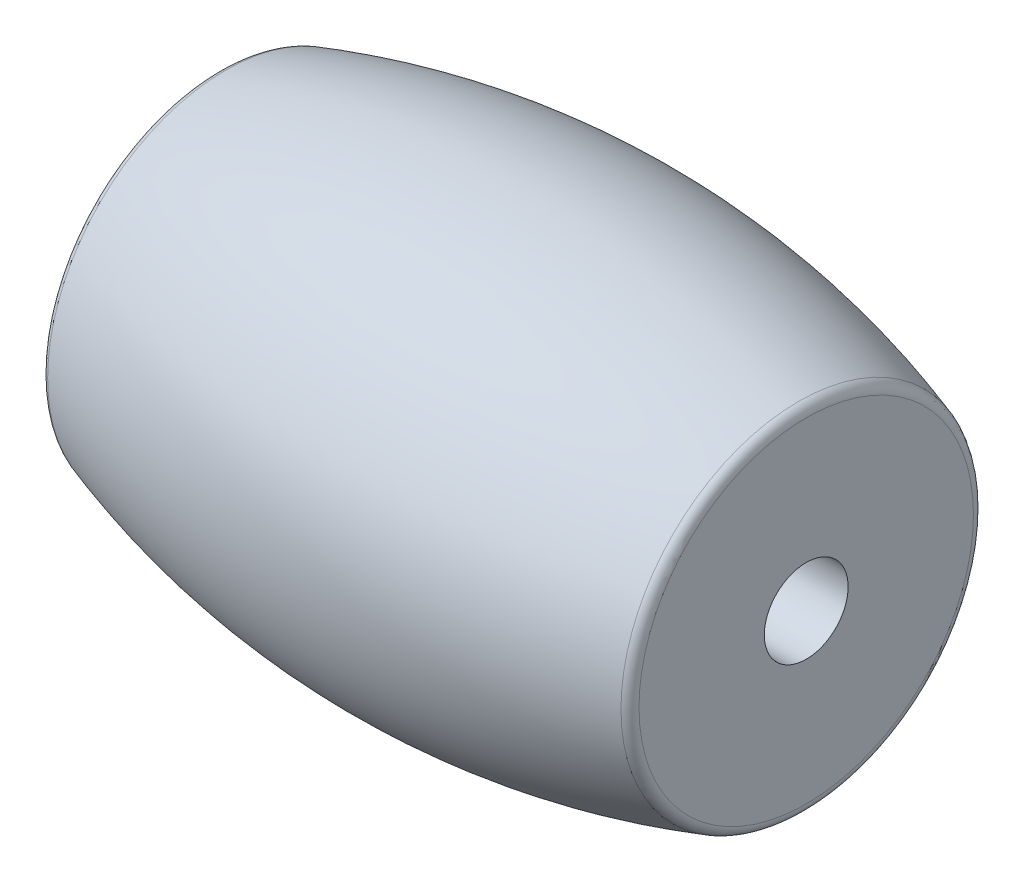
ISO-10303-21;
HEADER;
FILE_DESCRIPTION(('STEP AP214'),'2;1');
FILE_NAME('part.step','',(''),(''),'','','');
FILE_SCHEMA(('AUTOMOTIVE_DESIGN { 1 0 10303 214 1 1 1 1 }'));
ENDSEC;
DATA;
#1=APPLICATION_CONTEXT('core data for automotive mechanical design processes');
#2=APPLICATION_PROTOCOL_DEFINITION('international standard','automotive_design',2000,#1);
#3=PRODUCT_CONTEXT('',#1,'mechanical');
#4=PRODUCT('Part','Part','',(#3));
#5=PRODUCT_RELATED_PRODUCT_CATEGORY('part','',(#4));
#6=PRODUCT_DEFINITION_FORMATION('','',#4);
#7=PRODUCT_DEFINITION_CONTEXT('part definition',#1,'design');
#8=PRODUCT_DEFINITION('design','',#6,#7);
#9=PRODUCT_DEFINITION_SHAPE('','',#8);
#10=(LENGTH_UNIT() NAMED_UNIT(*) SI_UNIT(.MILLI.,.METRE.));
#11=(NAMED_UNIT(*) PLANE_ANGLE_UNIT() SI_UNIT($,.RADIAN.));
#12=(NAMED_UNIT(*) SI_UNIT($,.STERADIAN.) SOLID_ANGLE_UNIT());
#13=UNCERTAINTY_MEASURE_WITH_UNIT(LENGTH_MEASURE(1.E-05),#10,'distance_accuracy_value','');
#14=(GEOMETRIC_REPRESENTATION_CONTEXT(3) GLOBAL_UNCERTAINTY_ASSIGNED_CONTEXT((#13)) GLOBAL_UNIT_ASSIGNED_CONTEXT((#10,
#11,#12)) REPRESENTATION_CONTEXT('',''));
#15=CARTESIAN_POINT('',(0.,0.,0.));
#16=DIRECTION('',(0.,0.,1.));
#17=DIRECTION('',(1.,0.,0.));
#18=AXIS2_PLACEMENT_3D('',#15,#16,#17);
#19=CARTESIAN_POINT('',(26.67,0.,0.));
#20=DIRECTION('',(-1.,0.,0.));
#21=DIRECTION('',(0.,0.,1.));
#22=AXIS2_PLACEMENT_3D('',#19,#20,#21);
#23=CYLINDRICAL_SURFACE('',#22,1.9);
#24=CARTESIAN_POINT('',(0.,0.,0.));
#25=DIRECTION('',(-1.,0.,0.));
#26=DIRECTION('',(0.,0.,1.));
#27=AXIS2_PLACEMENT_3D('',#24,#25,#26);
#28=CIRCLE('',#27,1.9);
#29=CARTESIAN_POINT('',(0.,0.,1.9));
#30=VERTEX_POINT('',#29);
#31=EDGE_CURVE('E52',#30,#30,#28,.T.);
#32=ORIENTED_EDGE('',*,*,#31,.T.);
#33=EDGE_LOOP('',(#32));
#34=FACE_BOUND('',#33,.T.);
#35=CARTESIAN_POINT('',(26.67,0.,0.));
#36=DIRECTION('',(-1.,0.,0.));
#37=DIRECTION('',(0.,0.,1.));
#38=AXIS2_PLACEMENT_3D('',#35,#36,#37);
#39=CIRCLE('',#38,1.9);
#40=CARTESIAN_POINT('',(26.67,0.,1.9));
#41=VERTEX_POINT('',#40);
#42=EDGE_CURVE('E188',#41,#41,#39,.F.);
#43=ORIENTED_EDGE('',*,*,#42,.T.);
#44=EDGE_LOOP('',(#43));
#45=FACE_BOUND('',#44,.T.);
#46=ADVANCED_FACE('F17',(#34,#45),#23,.F.);
#47=CARTESIAN_POINT('',(26.67,0.,0.));
#48=DIRECTION('',(-1.,0.,0.));
#49=DIRECTION('',(0.,0.,1.));
#50=AXIS2_PLACEMENT_3D('',#47,#48,#49);
#51=PLANE('',#50);
#52=ORIENTED_EDGE('',*,*,#42,.F.);
#53=EDGE_LOOP('',(#52));
#54=FACE_BOUND('',#53,.T.);
#55=CARTESIAN_POINT('',(26.67,0.,0.));
#56=DIRECTION('',(-1.,0.,0.));
#57=DIRECTION('',(0.,0.,1.));
#58=AXIS2_PLACEMENT_3D('',#55,#56,#57);
#59=CIRCLE('',#58,7.57820673719301);
#60=CARTESIAN_POINT('',(26.67,0.,7.57820673719301));
#61=VERTEX_POINT('',#60);
#62=CARTESIAN_POINT('',(26.67,0.,-7.57820673719301));
#63=VERTEX_POINT('',#62);
#64=EDGE_CURVE('E45',#61,#63,#59,.T.);
#65=ORIENTED_EDGE('',*,*,#64,.F.);
#66=CARTESIAN_POINT('',(26.67,0.,0.));
#67=DIRECTION('',(-1.,0.,0.));
#68=DIRECTION('',(0.,0.,-1.));
#69=AXIS2_PLACEMENT_3D('',#66,#67,#68);
#70=CIRCLE('',#69,7.57820673719301);
#71=EDGE_CURVE('E48',#63,#61,#70,.T.);
#72=ORIENTED_EDGE('',*,*,#71,.F.);
#73=EDGE_LOOP('',(#65,#72));
#74=FACE_BOUND('',#73,.T.);
#75=ADVANCED_FACE('F50',(#54,#74),#51,.F.);
#76=CARTESIAN_POINT('',(0.,0.,0.));
#77=DIRECTION('',(1.,0.,0.));
#78=DIRECTION('',(0.,0.,-1.));
#79=AXIS2_PLACEMENT_3D('',#76,#77,#78);
#80=PLANE('',#79);
#81=ORIENTED_EDGE('',*,*,#31,.F.);
#82=EDGE_LOOP('',(#81));
#83=FACE_BOUND('',#82,.T.);
#84=CARTESIAN_POINT('',(0.,0.,0.));
#85=DIRECTION('',(1.,0.,0.));
#86=DIRECTION('',(0.,0.,-1.));
#87=AXIS2_PLACEMENT_3D('',#84,#85,#86);
#88=CIRCLE('',#87,7.57820673719301);
#89=CARTESIAN_POINT('',(0.,0.,-7.57820673719301));
#90=VERTEX_POINT('',#89);
#91=CARTESIAN_POINT('',(0.,0.,7.57820673719301));
#92=VERTEX_POINT('',#91);
#93=EDGE_CURVE('E57',#90,#92,#88,.T.);
#94=ORIENTED_EDGE('',*,*,#93,.F.);
#95=CARTESIAN_POINT('',(0.,0.,0.));
#96=DIRECTION('',(1.,0.,0.));
#97=DIRECTION('',(0.,0.,1.));
#98=AXIS2_PLACEMENT_3D('',#95,#96,#97);
#99=CIRCLE('',#98,7.57820673719301);
#100=EDGE_CURVE('E36',#92,#90,#99,.T.);
#101=ORIENTED_EDGE('',*,*,#100,.F.);
#102=EDGE_LOOP('',(#94,#101));
#103=FACE_BOUND('',#102,.T.);
#104=ADVANCED_FACE('F76',(#83,#103),#80,.F.);
#105=CARTESIAN_POINT('',(26.17,0.,0.));
#106=DIRECTION('',(-1.,0.,0.));
#107=DIRECTION('',(0.,0.,1.));
#108=AXIS2_PLACEMENT_3D('',#105,#106,#107);
#109=TOROIDAL_SURFACE('',#108,7.57820673719301,0.5);
#110=CARTESIAN_POINT('',(26.3273881054568,0.,0.));
#111=DIRECTION('',(-1.,0.,0.));
#112=DIRECTION('',(0.,0.,1.));
#113=AXIS2_PLACEMENT_3D('',#110,#111,#112);
#114=CIRCLE('',#113,8.05278969544239);
#115=CARTESIAN_POINT('',(26.3273881054568,0.,8.05278969544239));
#116=VERTEX_POINT('',#115);
#117=EDGE_CURVE('E28',#116,#116,#114,.T.);
#118=ORIENTED_EDGE('',*,*,#117,.F.);
#119=EDGE_LOOP('',(#118));
#120=FACE_BOUND('',#119,.T.);
#121=ORIENTED_EDGE('',*,*,#64,.T.);
#122=ORIENTED_EDGE('',*,*,#71,.T.);
#123=EDGE_LOOP('',(#121,#122));
#124=FACE_BOUND('',#123,.T.);
#125=ADVANCED_FACE('F56',(#120,#124),#109,.T.);
#126=CARTESIAN_POINT('',(0.499999999999999,0.,0.));
#127=DIRECTION('',(1.,0.,0.));
#128=DIRECTION('',(0.,0.,-1.));
#129=AXIS2_PLACEMENT_3D('',#126,#127,#128);
#130=TOROIDAL_SURFACE('',#129,7.57820673719301,0.5);
#131=CARTESIAN_POINT('',(0.342611894543236,0.,0.));
#132=DIRECTION('',(-1.,0.,0.));
#133=DIRECTION('',(0.,0.,1.));
#134=AXIS2_PLACEMENT_3D('',#131,#132,#133);
#135=CIRCLE('',#134,8.0527896954424);
#136=CARTESIAN_POINT('',(0.342611894543236,0.,8.0527896954424));
#137=VERTEX_POINT('',#136);
#138=EDGE_CURVE('E10',#137,#137,#135,.F.);
#139=ORIENTED_EDGE('',*,*,#138,.F.);
#140=EDGE_LOOP('',(#139));
#141=FACE_BOUND('',#140,.T.);
#142=ORIENTED_EDGE('',*,*,#93,.T.);
#143=ORIENTED_EDGE('',*,*,#100,.T.);
#144=EDGE_LOOP('',(#142,#143));
#145=FACE_BOUND('',#144,.T.);
#146=ADVANCED_FACE('F75',(#141,#145),#130,.T.);
#147=CARTESIAN_POINT('',(13.335,0.,-31.1240335080434));
#148=DIRECTION('',(0.,1.,0.));
#149=DIRECTION('',(0.,0.,1.));
#150=AXIS2_PLACEMENT_3D('',#147,#148,#149);
#151=CIRCLE('',#150,41.275);
#152=TRIMMED_CURVE('',#151,(PARAMETER_VALUE(-0.716566918912026)),
(PARAMETER_VALUE(0.716566918912026)),.T.,.PARAMETER.);
#153=CARTESIAN_POINT('',(13.335,0.,0.));
#154=DIRECTION('',(-1.,0.,0.));
#155=AXIS1_PLACEMENT('',#153,#154);
#156=SURFACE_OF_REVOLUTION('',#152,#155);
#157=ORIENTED_EDGE('',*,*,#138,.T.);
#158=EDGE_LOOP('',(#157));
#159=FACE_BOUND('',#158,.T.);
#160=ORIENTED_EDGE('',*,*,#117,.T.);
#161=EDGE_LOOP('',(#160));
#162=FACE_BOUND('',#161,.T.);
#163=ADVANCED_FACE('F132',(#159,#162),#156,.F.);
#164=CLOSED_SHELL('',(#46,#75,#104,#125,#146,#163));
#165=MANIFOLD_SOLID_BREP('B1',#164);
#166=ADVANCED_BREP_SHAPE_REPRESENTATION('',(#18,#165),#14);
#167=SHAPE_DEFINITION_REPRESENTATION(#9,#166);
ENDSEC;
END-ISO-10303-21;
